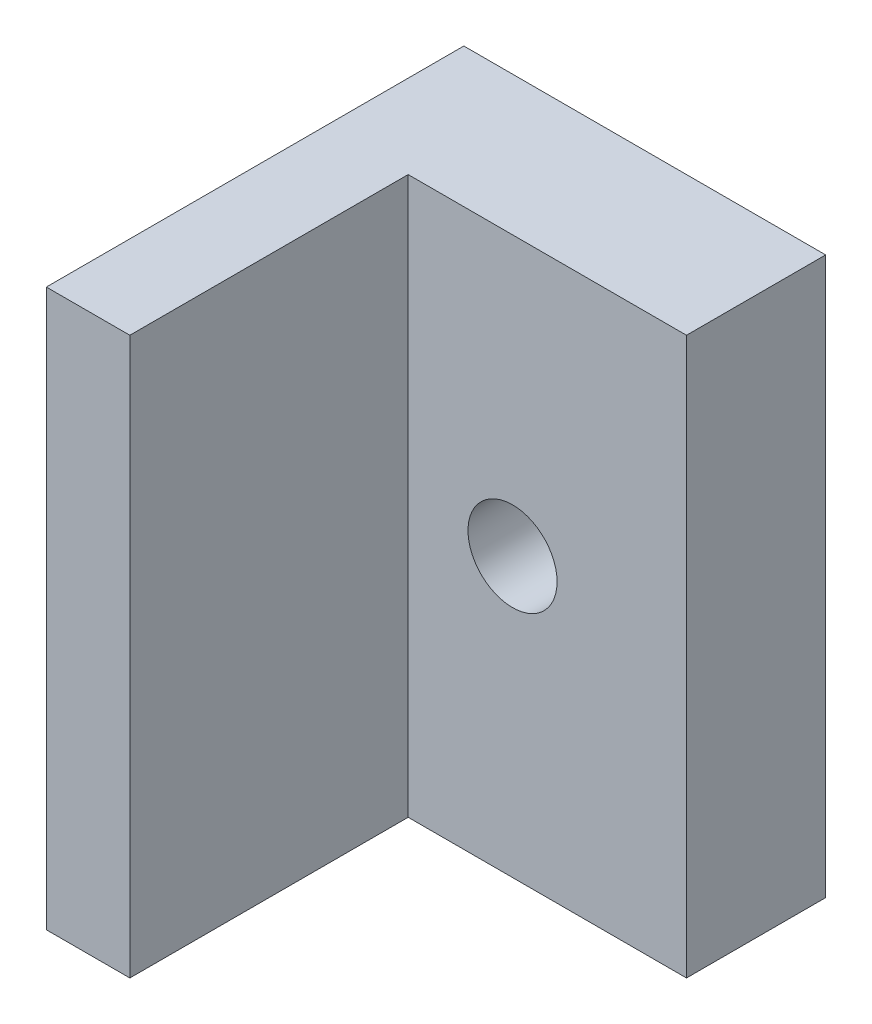
ISO-10303-21;
HEADER;
FILE_DESCRIPTION(('STEP AP214'),'2;1');
FILE_NAME('part.step','',(''),(''),'','','');
FILE_SCHEMA(('AUTOMOTIVE_DESIGN { 1 0 10303 214 1 1 1 1 }'));
ENDSEC;
DATA;
#1=APPLICATION_CONTEXT('core data for automotive mechanical design processes');
#2=APPLICATION_PROTOCOL_DEFINITION('international standard','automotive_design',2000,#1);
#3=PRODUCT_CONTEXT('',#1,'mechanical');
#4=PRODUCT('Part','Part','',(#3));
#5=PRODUCT_RELATED_PRODUCT_CATEGORY('part','',(#4));
#6=PRODUCT_DEFINITION_FORMATION('','',#4);
#7=PRODUCT_DEFINITION_CONTEXT('part definition',#1,'design');
#8=PRODUCT_DEFINITION('design','',#6,#7);
#9=PRODUCT_DEFINITION_SHAPE('','',#8);
#10=(LENGTH_UNIT() NAMED_UNIT(*) SI_UNIT(.MILLI.,.METRE.));
#11=(NAMED_UNIT(*) PLANE_ANGLE_UNIT() SI_UNIT($,.RADIAN.));
#12=(NAMED_UNIT(*) SI_UNIT($,.STERADIAN.) SOLID_ANGLE_UNIT());
#13=UNCERTAINTY_MEASURE_WITH_UNIT(LENGTH_MEASURE(1.E-05),#10,'distance_accuracy_value','');
#14=(GEOMETRIC_REPRESENTATION_CONTEXT(3) GLOBAL_UNCERTAINTY_ASSIGNED_CONTEXT((#13)) GLOBAL_UNIT_ASSIGNED_CONTEXT((#10,
#11,#12)) REPRESENTATION_CONTEXT('',''));
#15=CARTESIAN_POINT('',(0.,0.,0.));
#16=DIRECTION('',(0.,0.,1.));
#17=DIRECTION('',(1.,0.,0.));
#18=AXIS2_PLACEMENT_3D('',#15,#16,#17);
#19=CARTESIAN_POINT('',(6.25000000000001,0.,5.));
#20=DIRECTION('',(1.,0.,0.));
#21=DIRECTION('',(0.,1.,0.));
#22=AXIS2_PLACEMENT_3D('',#19,#20,#21);
#23=PLANE('',#22);
#24=DIRECTION('',(0.,-1.,0.));
#25=VECTOR('',#24,1.);
#26=CARTESIAN_POINT('',(6.25000000000001,0.,0.));
#27=LINE('',#26,#25);
#28=CARTESIAN_POINT('',(6.25,10.,0.));
#29=VERTEX_POINT('',#28);
#30=CARTESIAN_POINT('',(6.25000000000001,-10.,0.));
#31=VERTEX_POINT('',#30);
#32=EDGE_CURVE('E85',#29,#31,#27,.T.);
#33=ORIENTED_EDGE('',*,*,#32,.F.);
#34=DIRECTION('',(0.,0.,-1.));
#35=VECTOR('',#34,1.);
#36=CARTESIAN_POINT('',(6.25,10.,5.));
#37=LINE('',#36,#35);
#38=CARTESIAN_POINT('',(6.25,10.,5.));
#39=VERTEX_POINT('',#38);
#40=EDGE_CURVE('E11',#39,#29,#37,.T.);
#41=ORIENTED_EDGE('',*,*,#40,.F.);
#42=DIRECTION('',(0.,-1.,0.));
#43=VECTOR('',#42,1.);
#44=CARTESIAN_POINT('',(6.25000000000001,0.,5.));
#45=LINE('',#44,#43);
#46=CARTESIAN_POINT('',(6.25000000000001,-10.,5.));
#47=VERTEX_POINT('',#46);
#48=EDGE_CURVE('E87',#39,#47,#45,.T.);
#49=ORIENTED_EDGE('',*,*,#48,.T.);
#50=DIRECTION('',(0.,0.,-1.));
#51=VECTOR('',#50,1.);
#52=CARTESIAN_POINT('',(6.25000000000001,-10.,5.));
#53=LINE('',#52,#51);
#54=EDGE_CURVE('E81',#47,#31,#53,.T.);
#55=ORIENTED_EDGE('',*,*,#54,.T.);
#56=EDGE_LOOP('',(#33,#41,#49,#55));
#57=FACE_BOUND('',#56,.T.);
#58=ADVANCED_FACE('F41',(#57),#23,.T.);
#59=CARTESIAN_POINT('',(0.,10.,5.));
#60=DIRECTION('',(0.,1.,0.));
#61=DIRECTION('',(0.,0.,1.));
#62=AXIS2_PLACEMENT_3D('',#59,#60,#61);
#63=PLANE('',#62);
#64=DIRECTION('',(1.,0.,0.));
#65=VECTOR('',#64,1.);
#66=CARTESIAN_POINT('',(0.,10.,0.));
#67=LINE('',#66,#65);
#68=CARTESIAN_POINT('',(-6.75,10.,0.));
#69=VERTEX_POINT('',#68);
#70=EDGE_CURVE('E106',#69,#29,#67,.T.);
#71=ORIENTED_EDGE('',*,*,#70,.F.);
#72=DIRECTION('',(0.,0.,-1.));
#73=VECTOR('',#72,1.);
#74=CARTESIAN_POINT('',(-6.75,10.,5.));
#75=LINE('',#74,#73);
#76=CARTESIAN_POINT('',(-6.75,10.,15.));
#77=VERTEX_POINT('',#76);
#78=EDGE_CURVE('E50',#77,#69,#75,.T.);
#79=ORIENTED_EDGE('',*,*,#78,.F.);
#80=DIRECTION('',(-1.,0.,0.));
#81=VECTOR('',#80,1.);
#82=CARTESIAN_POINT('',(-6.75,10.,15.));
#83=LINE('',#82,#81);
#84=CARTESIAN_POINT('',(-3.75,10.,15.));
#85=VERTEX_POINT('',#84);
#86=EDGE_CURVE('E152',#85,#77,#83,.T.);
#87=ORIENTED_EDGE('',*,*,#86,.F.);
#88=DIRECTION('',(0.,0.,-1.));
#89=VECTOR('',#88,1.);
#90=CARTESIAN_POINT('',(-3.75,10.,15.));
#91=LINE('',#90,#89);
#92=CARTESIAN_POINT('',(-3.75,10.,5.));
#93=VERTEX_POINT('',#92);
#94=EDGE_CURVE('E149',#85,#93,#91,.T.);
#95=ORIENTED_EDGE('',*,*,#94,.T.);
#96=DIRECTION('',(1.,0.,0.));
#97=VECTOR('',#96,1.);
#98=CARTESIAN_POINT('',(0.,10.,5.));
#99=LINE('',#98,#97);
#100=EDGE_CURVE('E133',#93,#39,#99,.T.);
#101=ORIENTED_EDGE('',*,*,#100,.T.);
#102=ORIENTED_EDGE('',*,*,#40,.T.);
#103=EDGE_LOOP('',(#71,#79,#87,#95,#101,#102));
#104=FACE_BOUND('',#103,.T.);
#105=ADVANCED_FACE('F131',(#104),#63,.T.);
#106=CARTESIAN_POINT('',(-6.75,0.,5.));
#107=DIRECTION('',(1.,0.,0.));
#108=DIRECTION('',(0.,1.,0.));
#109=AXIS2_PLACEMENT_3D('',#106,#107,#108);
#110=PLANE('',#109);
#111=DIRECTION('',(0.,-1.,0.));
#112=VECTOR('',#111,1.);
#113=CARTESIAN_POINT('',(-6.75,0.,0.));
#114=LINE('',#113,#112);
#115=CARTESIAN_POINT('',(-6.74999999999999,-10.,0.));
#116=VERTEX_POINT('',#115);
#117=EDGE_CURVE('E102',#69,#116,#114,.T.);
#118=ORIENTED_EDGE('',*,*,#117,.T.);
#119=DIRECTION('',(0.,0.,-1.));
#120=VECTOR('',#119,1.);
#121=CARTESIAN_POINT('',(-6.74999999999999,-10.,5.));
#122=LINE('',#121,#120);
#123=CARTESIAN_POINT('',(-6.75,-10.,15.));
#124=VERTEX_POINT('',#123);
#125=EDGE_CURVE('E90',#124,#116,#122,.T.);
#126=ORIENTED_EDGE('',*,*,#125,.F.);
#127=DIRECTION('',(0.,-1.,0.));
#128=VECTOR('',#127,1.);
#129=CARTESIAN_POINT('',(-6.75,10.,15.));
#130=LINE('',#129,#128);
#131=EDGE_CURVE('E127',#77,#124,#130,.T.);
#132=ORIENTED_EDGE('',*,*,#131,.F.);
#133=ORIENTED_EDGE('',*,*,#78,.T.);
#134=EDGE_LOOP('',(#118,#126,#132,#133));
#135=FACE_BOUND('',#134,.T.);
#136=ADVANCED_FACE('F125',(#135),#110,.F.);
#137=CARTESIAN_POINT('',(0.,0.,5.));
#138=DIRECTION('',(0.,0.,-1.));
#139=DIRECTION('',(-1.,0.,0.));
#140=AXIS2_PLACEMENT_3D('',#137,#138,#139);
#141=CYLINDRICAL_SURFACE('',#140,1.6);
#142=CARTESIAN_POINT('',(0.,0.,5.));
#143=DIRECTION('',(0.,0.,1.));
#144=DIRECTION('',(1.,0.,0.));
#145=AXIS2_PLACEMENT_3D('',#142,#143,#144);
#146=CIRCLE('',#145,1.6);
#147=CARTESIAN_POINT('',(1.6,0.,5.));
#148=VERTEX_POINT('',#147);
#149=EDGE_CURVE('E101',#148,#148,#146,.T.);
#150=ORIENTED_EDGE('',*,*,#149,.T.);
#151=EDGE_LOOP('',(#150));
#152=FACE_BOUND('',#151,.T.);
#153=CARTESIAN_POINT('',(0.,0.,0.));
#154=DIRECTION('',(0.,0.,1.));
#155=DIRECTION('',(1.,0.,0.));
#156=AXIS2_PLACEMENT_3D('',#153,#154,#155);
#157=CIRCLE('',#156,1.6);
#158=CARTESIAN_POINT('',(1.6,0.,0.));
#159=VERTEX_POINT('',#158);
#160=EDGE_CURVE('E108',#159,#159,#157,.T.);
#161=ORIENTED_EDGE('',*,*,#160,.F.);
#162=EDGE_LOOP('',(#161));
#163=FACE_BOUND('',#162,.T.);
#164=ADVANCED_FACE('F43',(#152,#163),#141,.F.);
#165=CARTESIAN_POINT('',(0.,-10.,5.));
#166=DIRECTION('',(0.,1.,0.));
#167=DIRECTION('',(0.,0.,1.));
#168=AXIS2_PLACEMENT_3D('',#165,#166,#167);
#169=PLANE('',#168);
#170=DIRECTION('',(1.,0.,0.));
#171=VECTOR('',#170,1.);
#172=CARTESIAN_POINT('',(0.,-10.,0.));
#173=LINE('',#172,#171);
#174=EDGE_CURVE('E93',#116,#31,#173,.T.);
#175=ORIENTED_EDGE('',*,*,#174,.T.);
#176=ORIENTED_EDGE('',*,*,#54,.F.);
#177=DIRECTION('',(1.,0.,0.));
#178=VECTOR('',#177,1.);
#179=CARTESIAN_POINT('',(0.,-10.,5.));
#180=LINE('',#179,#178);
#181=CARTESIAN_POINT('',(-3.75,-10.,5.));
#182=VERTEX_POINT('',#181);
#183=EDGE_CURVE('E62',#182,#47,#180,.T.);
#184=ORIENTED_EDGE('',*,*,#183,.F.);
#185=DIRECTION('',(0.,0.,-1.));
#186=VECTOR('',#185,1.);
#187=CARTESIAN_POINT('',(-3.74999999999999,-10.,15.));
#188=LINE('',#187,#186);
#189=CARTESIAN_POINT('',(-3.74999999999999,-10.,15.));
#190=VERTEX_POINT('',#189);
#191=EDGE_CURVE('E114',#190,#182,#188,.T.);
#192=ORIENTED_EDGE('',*,*,#191,.F.);
#193=DIRECTION('',(1.,0.,0.));
#194=VECTOR('',#193,1.);
#195=CARTESIAN_POINT('',(-6.75,-10.,15.));
#196=LINE('',#195,#194);
#197=EDGE_CURVE('E161',#124,#190,#196,.T.);
#198=ORIENTED_EDGE('',*,*,#197,.F.);
#199=ORIENTED_EDGE('',*,*,#125,.T.);
#200=EDGE_LOOP('',(#175,#176,#184,#192,#198,#199));
#201=FACE_BOUND('',#200,.T.);
#202=ADVANCED_FACE('F94',(#201),#169,.F.);
#203=CARTESIAN_POINT('',(0.,0.,5.));
#204=DIRECTION('',(0.,0.,1.));
#205=DIRECTION('',(1.,0.,0.));
#206=AXIS2_PLACEMENT_3D('',#203,#204,#205);
#207=PLANE('',#206);
#208=DIRECTION('',(0.,1.,0.));
#209=VECTOR('',#208,1.);
#210=CARTESIAN_POINT('',(-3.75,10.,5.));
#211=LINE('',#210,#209);
#212=EDGE_CURVE('E57',#182,#93,#211,.T.);
#213=ORIENTED_EDGE('',*,*,#212,.F.);
#214=ORIENTED_EDGE('',*,*,#183,.T.);
#215=ORIENTED_EDGE('',*,*,#48,.F.);
#216=ORIENTED_EDGE('',*,*,#100,.F.);
#217=EDGE_LOOP('',(#213,#214,#215,#216));
#218=FACE_BOUND('',#217,.T.);
#219=ORIENTED_EDGE('',*,*,#149,.F.);
#220=EDGE_LOOP('',(#219));
#221=FACE_BOUND('',#220,.T.);
#222=ADVANCED_FACE('F134',(#218,#221),#207,.T.);
#223=CARTESIAN_POINT('',(0.,0.,0.));
#224=DIRECTION('',(0.,0.,1.));
#225=DIRECTION('',(1.,0.,0.));
#226=AXIS2_PLACEMENT_3D('',#223,#224,#225);
#227=PLANE('',#226);
#228=ORIENTED_EDGE('',*,*,#160,.T.);
#229=EDGE_LOOP('',(#228));
#230=FACE_BOUND('',#229,.T.);
#231=ORIENTED_EDGE('',*,*,#32,.T.);
#232=ORIENTED_EDGE('',*,*,#174,.F.);
#233=ORIENTED_EDGE('',*,*,#117,.F.);
#234=ORIENTED_EDGE('',*,*,#70,.T.);
#235=EDGE_LOOP('',(#231,#232,#233,#234));
#236=FACE_BOUND('',#235,.T.);
#237=ADVANCED_FACE('F104',(#230,#236),#227,.F.);
#238=CARTESIAN_POINT('',(-3.75,10.,15.));
#239=DIRECTION('',(-1.,0.,0.));
#240=DIRECTION('',(0.,-1.,0.));
#241=AXIS2_PLACEMENT_3D('',#238,#239,#240);
#242=PLANE('',#241);
#243=ORIENTED_EDGE('',*,*,#212,.T.);
#244=ORIENTED_EDGE('',*,*,#94,.F.);
#245=DIRECTION('',(0.,1.,0.));
#246=VECTOR('',#245,1.);
#247=CARTESIAN_POINT('',(-3.75,10.,15.));
#248=LINE('',#247,#246);
#249=EDGE_CURVE('E157',#190,#85,#248,.T.);
#250=ORIENTED_EDGE('',*,*,#249,.F.);
#251=ORIENTED_EDGE('',*,*,#191,.T.);
#252=EDGE_LOOP('',(#243,#244,#250,#251));
#253=FACE_BOUND('',#252,.T.);
#254=ADVANCED_FACE('F179',(#253),#242,.F.);
#255=CARTESIAN_POINT('',(0.,0.,15.));
#256=DIRECTION('',(0.,0.,1.));
#257=DIRECTION('',(1.,0.,0.));
#258=AXIS2_PLACEMENT_3D('',#255,#256,#257);
#259=PLANE('',#258);
#260=ORIENTED_EDGE('',*,*,#131,.T.);
#261=ORIENTED_EDGE('',*,*,#197,.T.);
#262=ORIENTED_EDGE('',*,*,#249,.T.);
#263=ORIENTED_EDGE('',*,*,#86,.T.);
#264=EDGE_LOOP('',(#260,#261,#262,#263));
#265=FACE_BOUND('',#264,.T.);
#266=ADVANCED_FACE('F168',(#265),#259,.T.);
#267=CLOSED_SHELL('',(#58,#105,#136,#164,#202,#222,#237,#254,#266));
#268=MANIFOLD_SOLID_BREP('B2',#267);
#269=ADVANCED_BREP_SHAPE_REPRESENTATION('',(#18,#268),#14);
#270=SHAPE_DEFINITION_REPRESENTATION(#9,#269);
ENDSEC;
END-ISO-10303-21;
